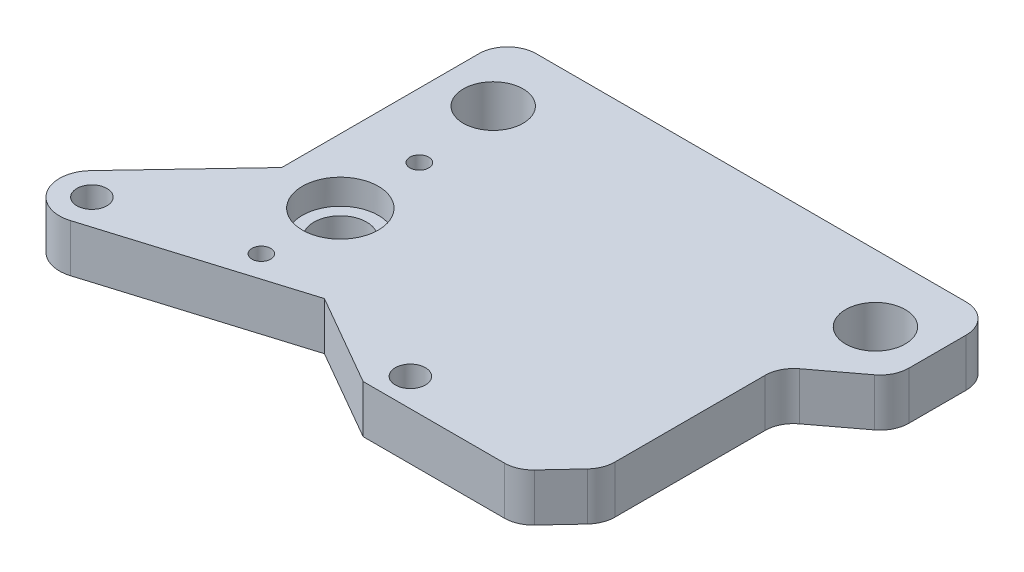
ISO-10303-21;
HEADER;
FILE_DESCRIPTION(('STEP AP214'),'2;1');
FILE_NAME('part.step','',(''),(''),'','','');
FILE_SCHEMA(('AUTOMOTIVE_DESIGN { 1 0 10303 214 1 1 1 1 }'));
ENDSEC;
DATA;
#1=APPLICATION_CONTEXT('core data for automotive mechanical design processes');
#2=APPLICATION_PROTOCOL_DEFINITION('international standard','automotive_design',2000,#1);
#3=PRODUCT_CONTEXT('',#1,'mechanical');
#4=PRODUCT('Part','Part','',(#3));
#5=PRODUCT_RELATED_PRODUCT_CATEGORY('part','',(#4));
#6=PRODUCT_DEFINITION_FORMATION('','',#4);
#7=PRODUCT_DEFINITION_CONTEXT('part definition',#1,'design');
#8=PRODUCT_DEFINITION('design','',#6,#7);
#9=PRODUCT_DEFINITION_SHAPE('','',#8);
#10=(LENGTH_UNIT() NAMED_UNIT(*) SI_UNIT(.MILLI.,.METRE.));
#11=(NAMED_UNIT(*) PLANE_ANGLE_UNIT() SI_UNIT($,.RADIAN.));
#12=(NAMED_UNIT(*) SI_UNIT($,.STERADIAN.) SOLID_ANGLE_UNIT());
#13=UNCERTAINTY_MEASURE_WITH_UNIT(LENGTH_MEASURE(1.E-05),#10,'distance_accuracy_value','');
#14=(GEOMETRIC_REPRESENTATION_CONTEXT(3) GLOBAL_UNCERTAINTY_ASSIGNED_CONTEXT((#13)) GLOBAL_UNIT_ASSIGNED_CONTEXT((#10,
#11,#12)) REPRESENTATION_CONTEXT('',''));
#15=CARTESIAN_POINT('',(0.,0.,0.));
#16=DIRECTION('',(0.,0.,1.));
#17=DIRECTION('',(1.,0.,0.));
#18=AXIS2_PLACEMENT_3D('',#15,#16,#17);
#19=CARTESIAN_POINT('',(0.,-6.35,0.));
#20=DIRECTION('',(0.,1.,0.));
#21=DIRECTION('',(0.,0.,1.));
#22=AXIS2_PLACEMENT_3D('',#19,#20,#21);
#23=CYLINDRICAL_SURFACE('',#22,5.05);
#24=CARTESIAN_POINT('',(0.,0.,0.));
#25=DIRECTION('',(0.,1.,0.));
#26=DIRECTION('',(0.,0.,1.));
#27=AXIS2_PLACEMENT_3D('',#24,#25,#26);
#28=CIRCLE('',#27,5.05);
#29=CARTESIAN_POINT('',(0.,0.,5.05));
#30=VERTEX_POINT('',#29);
#31=EDGE_CURVE('E266',#30,#30,#28,.T.);
#32=ORIENTED_EDGE('',*,*,#31,.T.);
#33=EDGE_LOOP('',(#32));
#34=FACE_BOUND('',#33,.T.);
#35=CARTESIAN_POINT('',(0.,-3.35,0.));
#36=DIRECTION('',(0.,-1.,0.));
#37=DIRECTION('',(0.,0.,-1.));
#38=AXIS2_PLACEMENT_3D('',#35,#36,#37);
#39=CIRCLE('',#38,5.05);
#40=CARTESIAN_POINT('',(0.,-3.35,-5.05));
#41=VERTEX_POINT('',#40);
#42=EDGE_CURVE('E11',#41,#41,#39,.F.);
#43=ORIENTED_EDGE('',*,*,#42,.F.);
#44=EDGE_LOOP('',(#43));
#45=FACE_BOUND('',#44,.T.);
#46=ADVANCED_FACE('F38',(#34,#45),#23,.F.);
#47=CARTESIAN_POINT('',(-17.78,-6.35,15.24));
#48=DIRECTION('',(0.,1.,0.));
#49=DIRECTION('',(0.,0.,1.));
#50=AXIS2_PLACEMENT_3D('',#47,#48,#49);
#51=CYLINDRICAL_SURFACE('',#50,4.318);
#52=CARTESIAN_POINT('',(-17.78,0.,15.24));
#53=DIRECTION('',(0.,1.,0.));
#54=DIRECTION('',(0.,0.,1.));
#55=AXIS2_PLACEMENT_3D('',#52,#53,#54);
#56=CIRCLE('',#55,4.318);
#57=CARTESIAN_POINT('',(-16.5178103251182,0.,19.3694068853313));
#58=VERTEX_POINT('',#57);
#59=CARTESIAN_POINT('',(-20.9174164667158,0.,12.2732270200805));
#60=VERTEX_POINT('',#59);
#61=EDGE_CURVE('E207',#58,#60,#56,.F.);
#62=ORIENTED_EDGE('',*,*,#61,.T.);
#63=DIRECTION('',(0.,1.,0.));
#64=VECTOR('',#63,1.);
#65=CARTESIAN_POINT('',(-20.9174164667158,-6.35,12.2732270200805));
#66=LINE('',#65,#64);
#67=CARTESIAN_POINT('',(-20.9174164667158,-6.35,12.2732270200805));
#68=VERTEX_POINT('',#67);
#69=EDGE_CURVE('E47',#68,#60,#66,.T.);
#70=ORIENTED_EDGE('',*,*,#69,.F.);
#71=CARTESIAN_POINT('',(-17.78,-6.35,15.24));
#72=DIRECTION('',(0.,1.,0.));
#73=DIRECTION('',(0.,0.,1.));
#74=AXIS2_PLACEMENT_3D('',#71,#72,#73);
#75=CIRCLE('',#74,4.318);
#76=CARTESIAN_POINT('',(-16.5178103251182,-6.35,19.3694068853313));
#77=VERTEX_POINT('',#76);
#78=EDGE_CURVE('E55',#77,#68,#75,.F.);
#79=ORIENTED_EDGE('',*,*,#78,.F.);
#80=DIRECTION('',(0.,1.,0.));
#81=VECTOR('',#80,1.);
#82=CARTESIAN_POINT('',(-16.5178103251182,-6.35,19.3694068853313));
#83=LINE('',#82,#81);
#84=EDGE_CURVE('E206',#77,#58,#83,.T.);
#85=ORIENTED_EDGE('',*,*,#84,.T.);
#86=EDGE_LOOP('',(#62,#70,#79,#85));
#87=FACE_BOUND('',#86,.T.);
#88=ADVANCED_FACE('F40',(#87),#51,.T.);
#89=CARTESIAN_POINT('',(-4.91597138022378,-6.35,-4.64859262888105));
#90=DIRECTION('',(-0.726590196089821,0.,-0.687071093080007));
#91=DIRECTION('',(-0.687071093080007,0.,0.726590196089821));
#92=AXIS2_PLACEMENT_3D('',#89,#90,#91);
#93=PLANE('',#92);
#94=DIRECTION('',(-0.687071093080007,0.,0.726590196089821));
#95=VECTOR('',#94,1.);
#96=CARTESIAN_POINT('',(-4.91597138022378,0.,-4.64859262888105));
#97=LINE('',#96,#95);
#98=CARTESIAN_POINT('',(-8.5725,0.,-0.781747008959347));
#99=VERTEX_POINT('',#98);
#100=EDGE_CURVE('E245',#99,#60,#97,.T.);
#101=ORIENTED_EDGE('',*,*,#100,.F.);
#102=DIRECTION('',(0.,1.,0.));
#103=VECTOR('',#102,1.);
#104=CARTESIAN_POINT('',(-8.5725,-6.35,-0.781747008959347));
#105=LINE('',#104,#103);
#106=CARTESIAN_POINT('',(-8.5725,-6.35,-0.781747008959347));
#107=VERTEX_POINT('',#106);
#108=EDGE_CURVE('E111',#107,#99,#105,.T.);
#109=ORIENTED_EDGE('',*,*,#108,.F.);
#110=DIRECTION('',(-0.687071093080007,0.,0.726590196089821));
#111=VECTOR('',#110,1.);
#112=CARTESIAN_POINT('',(-4.91597138022378,-6.35,-4.64859262888105));
#113=LINE('',#112,#111);
#114=EDGE_CURVE('E183',#107,#68,#113,.T.);
#115=ORIENTED_EDGE('',*,*,#114,.T.);
#116=ORIENTED_EDGE('',*,*,#69,.T.);
#117=EDGE_LOOP('',(#101,#109,#115,#116));
#118=FACE_BOUND('',#117,.T.);
#119=ADVANCED_FACE('F310',(#118),#93,.T.);
#120=CARTESIAN_POINT('',(-8.5725,-6.35,0.));
#121=DIRECTION('',(-1.,0.,0.));
#122=DIRECTION('',(0.,0.,1.));
#123=AXIS2_PLACEMENT_3D('',#120,#121,#122);
#124=PLANE('',#123);
#125=DIRECTION('',(0.,0.,1.));
#126=VECTOR('',#125,1.);
#127=CARTESIAN_POINT('',(-8.5725,0.,0.));
#128=LINE('',#127,#126);
#129=CARTESIAN_POINT('',(-8.5725,0.,-26.9875));
#130=VERTEX_POINT('',#129);
#131=EDGE_CURVE('E168',#130,#99,#128,.T.);
#132=ORIENTED_EDGE('',*,*,#131,.F.);
#133=DIRECTION('',(0.,1.,0.));
#134=VECTOR('',#133,1.);
#135=CARTESIAN_POINT('',(-8.5725,-6.35,-26.9875));
#136=LINE('',#135,#134);
#137=CARTESIAN_POINT('',(-8.5725,-6.35,-26.9875));
#138=VERTEX_POINT('',#137);
#139=EDGE_CURVE('E163',#138,#130,#136,.T.);
#140=ORIENTED_EDGE('',*,*,#139,.F.);
#141=DIRECTION('',(0.,0.,1.));
#142=VECTOR('',#141,1.);
#143=CARTESIAN_POINT('',(-8.5725,-6.35,0.));
#144=LINE('',#143,#142);
#145=EDGE_CURVE('E167',#138,#107,#144,.T.);
#146=ORIENTED_EDGE('',*,*,#145,.T.);
#147=ORIENTED_EDGE('',*,*,#108,.T.);
#148=EDGE_LOOP('',(#132,#140,#146,#147));
#149=FACE_BOUND('',#148,.T.);
#150=ADVANCED_FACE('F165',(#149),#124,.T.);
#151=CARTESIAN_POINT('',(-4.7625,-6.35,-26.9875));
#152=DIRECTION('',(0.,1.,0.));
#153=DIRECTION('',(0.,0.,1.));
#154=AXIS2_PLACEMENT_3D('',#151,#152,#153);
#155=CYLINDRICAL_SURFACE('',#154,3.81);
#156=CARTESIAN_POINT('',(-4.7625,0.,-26.9875));
#157=DIRECTION('',(0.,1.,0.));
#158=DIRECTION('',(0.,0.,1.));
#159=AXIS2_PLACEMENT_3D('',#156,#157,#158);
#160=CIRCLE('',#159,3.81);
#161=CARTESIAN_POINT('',(-4.7625,0.,-30.7975));
#162=VERTEX_POINT('',#161);
#163=EDGE_CURVE('E242',#130,#162,#160,.F.);
#164=ORIENTED_EDGE('',*,*,#163,.T.);
#165=DIRECTION('',(0.,1.,0.));
#166=VECTOR('',#165,1.);
#167=CARTESIAN_POINT('',(-4.7625,-6.35,-30.7975));
#168=LINE('',#167,#166);
#169=CARTESIAN_POINT('',(-4.7625,-6.35,-30.7975));
#170=VERTEX_POINT('',#169);
#171=EDGE_CURVE('E172',#170,#162,#168,.T.);
#172=ORIENTED_EDGE('',*,*,#171,.F.);
#173=CARTESIAN_POINT('',(-4.7625,-6.35,-26.9875));
#174=DIRECTION('',(0.,1.,0.));
#175=DIRECTION('',(0.,0.,1.));
#176=AXIS2_PLACEMENT_3D('',#173,#174,#175);
#177=CIRCLE('',#176,3.81);
#178=EDGE_CURVE('E175',#138,#170,#177,.F.);
#179=ORIENTED_EDGE('',*,*,#178,.F.);
#180=ORIENTED_EDGE('',*,*,#139,.T.);
#181=EDGE_LOOP('',(#164,#172,#179,#180));
#182=FACE_BOUND('',#181,.T.);
#183=ADVANCED_FACE('F176',(#182),#155,.T.);
#184=CARTESIAN_POINT('',(0.,-6.35,-30.7975));
#185=DIRECTION('',(0.,0.,-1.));
#186=DIRECTION('',(-1.,0.,0.));
#187=AXIS2_PLACEMENT_3D('',#184,#185,#186);
#188=PLANE('',#187);
#189=DIRECTION('',(-1.,0.,0.));
#190=VECTOR('',#189,1.);
#191=CARTESIAN_POINT('',(0.,0.,-30.7975));
#192=LINE('',#191,#190);
#193=CARTESIAN_POINT('',(52.3875,0.,-30.7975));
#194=VERTEX_POINT('',#193);
#195=EDGE_CURVE('E239',#194,#162,#192,.T.);
#196=ORIENTED_EDGE('',*,*,#195,.F.);
#197=DIRECTION('',(0.,1.,0.));
#198=VECTOR('',#197,1.);
#199=CARTESIAN_POINT('',(52.3875,-6.35,-30.7975));
#200=LINE('',#199,#198);
#201=CARTESIAN_POINT('',(52.3875,-6.35,-30.7975));
#202=VERTEX_POINT('',#201);
#203=EDGE_CURVE('E272',#202,#194,#200,.T.);
#204=ORIENTED_EDGE('',*,*,#203,.F.);
#205=DIRECTION('',(-1.,0.,0.));
#206=VECTOR('',#205,1.);
#207=CARTESIAN_POINT('',(0.,-6.35,-30.7975));
#208=LINE('',#207,#206);
#209=EDGE_CURVE('E179',#202,#170,#208,.T.);
#210=ORIENTED_EDGE('',*,*,#209,.T.);
#211=ORIENTED_EDGE('',*,*,#171,.T.);
#212=EDGE_LOOP('',(#196,#204,#210,#211));
#213=FACE_BOUND('',#212,.T.);
#214=ADVANCED_FACE('F429',(#213),#188,.T.);
#215=CARTESIAN_POINT('',(52.3875,-6.35,-26.9875));
#216=DIRECTION('',(0.,1.,0.));
#217=DIRECTION('',(0.,0.,1.));
#218=AXIS2_PLACEMENT_3D('',#215,#216,#217);
#219=CYLINDRICAL_SURFACE('',#218,3.81);
#220=CARTESIAN_POINT('',(52.3875,0.,-26.9875));
#221=DIRECTION('',(0.,1.,0.));
#222=DIRECTION('',(0.,0.,1.));
#223=AXIS2_PLACEMENT_3D('',#220,#221,#222);
#224=CIRCLE('',#223,3.81);
#225=CARTESIAN_POINT('',(56.1975,0.,-26.9875));
#226=VERTEX_POINT('',#225);
#227=EDGE_CURVE('E236',#194,#226,#224,.F.);
#228=ORIENTED_EDGE('',*,*,#227,.T.);
#229=DIRECTION('',(0.,1.,0.));
#230=VECTOR('',#229,1.);
#231=CARTESIAN_POINT('',(56.1975,-6.35,-26.9875));
#232=LINE('',#231,#230);
#233=CARTESIAN_POINT('',(56.1975,-6.35,-26.9875));
#234=VERTEX_POINT('',#233);
#235=EDGE_CURVE('E274',#234,#226,#232,.T.);
#236=ORIENTED_EDGE('',*,*,#235,.F.);
#237=CARTESIAN_POINT('',(52.3875,-6.35,-26.9875));
#238=DIRECTION('',(0.,1.,0.));
#239=DIRECTION('',(0.,0.,1.));
#240=AXIS2_PLACEMENT_3D('',#237,#238,#239);
#241=CIRCLE('',#240,3.81);
#242=EDGE_CURVE('E426',#202,#234,#241,.F.);
#243=ORIENTED_EDGE('',*,*,#242,.F.);
#244=ORIENTED_EDGE('',*,*,#203,.T.);
#245=EDGE_LOOP('',(#228,#236,#243,#244));
#246=FACE_BOUND('',#245,.T.);
#247=ADVANCED_FACE('F434',(#246),#219,.T.);
#248=CARTESIAN_POINT('',(56.1975,-6.35,1.02276151248003E-13));
#249=DIRECTION('',(1.,0.,0.));
#250=DIRECTION('',(0.,0.,-1.));
#251=AXIS2_PLACEMENT_3D('',#248,#249,#250);
#252=PLANE('',#251);
#253=DIRECTION('',(0.,0.,-1.));
#254=VECTOR('',#253,1.);
#255=CARTESIAN_POINT('',(56.1975,0.,1.02276151248003E-13));
#256=LINE('',#255,#254);
#257=CARTESIAN_POINT('',(56.1975,0.,-19.3620959266836));
#258=VERTEX_POINT('',#257);
#259=EDGE_CURVE('E233',#258,#226,#256,.T.);
#260=ORIENTED_EDGE('',*,*,#259,.F.);
#261=DIRECTION('',(0.,1.,0.));
#262=VECTOR('',#261,1.);
#263=CARTESIAN_POINT('',(56.1975,-6.35,-19.3620959266836));
#264=LINE('',#263,#262);
#265=CARTESIAN_POINT('',(56.1975,-6.35,-19.3620959266836));
#266=VERTEX_POINT('',#265);
#267=EDGE_CURVE('E276',#266,#258,#264,.T.);
#268=ORIENTED_EDGE('',*,*,#267,.F.);
#269=DIRECTION('',(0.,0.,-1.));
#270=VECTOR('',#269,1.);
#271=CARTESIAN_POINT('',(56.1975,-6.35,1.02276151248003E-13));
#272=LINE('',#271,#270);
#273=EDGE_CURVE('E423',#266,#234,#272,.T.);
#274=ORIENTED_EDGE('',*,*,#273,.T.);
#275=ORIENTED_EDGE('',*,*,#235,.T.);
#276=EDGE_LOOP('',(#260,#268,#274,#275));
#277=FACE_BOUND('',#276,.T.);
#278=ADVANCED_FACE('F438',(#277),#252,.T.);
#279=CARTESIAN_POINT('',(52.3875,-6.35,-19.3620959266836));
#280=DIRECTION('',(0.,1.,0.));
#281=DIRECTION('',(0.,0.,1.));
#282=AXIS2_PLACEMENT_3D('',#279,#280,#281);
#283=CYLINDRICAL_SURFACE('',#282,3.81);
#284=CARTESIAN_POINT('',(52.3875,0.,-19.3620959266836));
#285=DIRECTION('',(0.,1.,0.));
#286=DIRECTION('',(0.,0.,1.));
#287=AXIS2_PLACEMENT_3D('',#284,#285,#286);
#288=CIRCLE('',#287,3.81);
#289=CARTESIAN_POINT('',(54.6804152382093,0.,-16.3192946334034));
#290=VERTEX_POINT('',#289);
#291=EDGE_CURVE('E230',#258,#290,#288,.F.);
#292=ORIENTED_EDGE('',*,*,#291,.T.);
#293=DIRECTION('',(0.,1.,0.));
#294=VECTOR('',#293,1.);
#295=CARTESIAN_POINT('',(54.6804152382093,-6.35,-16.3192946334034));
#296=LINE('',#295,#294);
#297=CARTESIAN_POINT('',(54.6804152382093,-6.35,-16.3192946334034));
#298=VERTEX_POINT('',#297);
#299=EDGE_CURVE('E278',#298,#290,#296,.T.);
#300=ORIENTED_EDGE('',*,*,#299,.F.);
#301=CARTESIAN_POINT('',(52.3875,-6.35,-19.3620959266836));
#302=DIRECTION('',(0.,1.,0.));
#303=DIRECTION('',(0.,0.,1.));
#304=AXIS2_PLACEMENT_3D('',#301,#302,#303);
#305=CIRCLE('',#304,3.81);
#306=EDGE_CURVE('E421',#266,#298,#305,.F.);
#307=ORIENTED_EDGE('',*,*,#306,.F.);
#308=ORIENTED_EDGE('',*,*,#267,.T.);
#309=EDGE_LOOP('',(#292,#300,#307,#308));
#310=FACE_BOUND('',#309,.T.);
#311=ADVANCED_FACE('F443',(#310),#283,.T.);
#312=CARTESIAN_POINT('',(11.9606686655756,-6.35,15.8723434157696));
#313=DIRECTION('',(0.601815023152047,0.,0.798635510047294));
#314=DIRECTION('',(0.798635510047294,0.,-0.601815023152047));
#315=AXIS2_PLACEMENT_3D('',#312,#313,#314);
#316=PLANE('',#315);
#317=DIRECTION('',(0.798635510047294,0.,-0.601815023152047));
#318=VECTOR('',#317,1.);
#319=CARTESIAN_POINT('',(11.9606686655756,0.,15.8723434157696));
#320=LINE('',#319,#318);
#321=CARTESIAN_POINT('',(48.9855664772033,0.,-12.0279182848244));
#322=VERTEX_POINT('',#321);
#323=EDGE_CURVE('E227',#322,#290,#320,.T.);
#324=ORIENTED_EDGE('',*,*,#323,.F.);
#325=DIRECTION('',(0.,1.,0.));
#326=VECTOR('',#325,1.);
#327=CARTESIAN_POINT('',(48.9855664772033,-6.35,-12.0279182848244));
#328=LINE('',#327,#326);
#329=CARTESIAN_POINT('',(48.9855664772033,-6.35,-12.0279182848244));
#330=VERTEX_POINT('',#329);
#331=EDGE_CURVE('E280',#330,#322,#328,.T.);
#332=ORIENTED_EDGE('',*,*,#331,.F.);
#333=DIRECTION('',(0.798635510047294,0.,-0.601815023152047));
#334=VECTOR('',#333,1.);
#335=CARTESIAN_POINT('',(11.9606686655756,-6.35,15.8723434157696));
#336=LINE('',#335,#334);
#337=EDGE_CURVE('E418',#330,#298,#336,.T.);
#338=ORIENTED_EDGE('',*,*,#337,.T.);
#339=ORIENTED_EDGE('',*,*,#299,.T.);
#340=EDGE_LOOP('',(#324,#332,#338,#339));
#341=FACE_BOUND('',#340,.T.);
#342=ADVANCED_FACE('F479',(#341),#316,.T.);
#343=CARTESIAN_POINT('',(51.2784817154126,-6.35,-8.98511699154425));
#344=DIRECTION('',(0.,1.,0.));
#345=DIRECTION('',(0.,0.,1.));
#346=AXIS2_PLACEMENT_3D('',#343,#344,#345);
#347=CYLINDRICAL_SURFACE('',#346,3.80999999999999);
#348=CARTESIAN_POINT('',(51.2784817154126,0.,-8.98511699154425));
#349=DIRECTION('',(0.,1.,0.));
#350=DIRECTION('',(0.,0.,1.));
#351=AXIS2_PLACEMENT_3D('',#348,#349,#350);
#352=CIRCLE('',#351,3.80999999999999);
#353=CARTESIAN_POINT('',(47.4684817154126,0.,-8.98511699154425));
#354=VERTEX_POINT('',#353);
#355=EDGE_CURVE('E224',#354,#322,#352,.F.);
#356=ORIENTED_EDGE('',*,*,#355,.F.);
#357=DIRECTION('',(0.,1.,0.));
#358=VECTOR('',#357,1.);
#359=CARTESIAN_POINT('',(47.4684817154126,-6.35,-8.98511699154425));
#360=LINE('',#359,#358);
#361=CARTESIAN_POINT('',(47.4684817154126,-6.35,-8.98511699154425));
#362=VERTEX_POINT('',#361);
#363=EDGE_CURVE('E282',#362,#354,#360,.T.);
#364=ORIENTED_EDGE('',*,*,#363,.F.);
#365=CARTESIAN_POINT('',(51.2784817154126,-6.35,-8.98511699154425));
#366=DIRECTION('',(0.,1.,0.));
#367=DIRECTION('',(0.,0.,1.));
#368=AXIS2_PLACEMENT_3D('',#365,#366,#367);
#369=CIRCLE('',#368,3.80999999999999);
#370=EDGE_CURVE('E415',#362,#330,#369,.F.);
#371=ORIENTED_EDGE('',*,*,#370,.T.);
#372=ORIENTED_EDGE('',*,*,#331,.T.);
#373=EDGE_LOOP('',(#356,#364,#371,#372));
#374=FACE_BOUND('',#373,.T.);
#375=ADVANCED_FACE('F449',(#374),#347,.F.);
#376=CARTESIAN_POINT('',(47.4684817154126,-6.35,0.));
#377=DIRECTION('',(-1.,0.,0.));
#378=DIRECTION('',(0.,0.,1.));
#379=AXIS2_PLACEMENT_3D('',#376,#377,#378);
#380=PLANE('',#379);
#381=DIRECTION('',(0.,0.,1.));
#382=VECTOR('',#381,1.);
#383=CARTESIAN_POINT('',(47.4684817154126,0.,0.));
#384=LINE('',#383,#382);
#385=CARTESIAN_POINT('',(47.4684817154126,0.,10.9806107725939));
#386=VERTEX_POINT('',#385);
#387=EDGE_CURVE('E222',#354,#386,#384,.T.);
#388=ORIENTED_EDGE('',*,*,#387,.T.);
#389=DIRECTION('',(0.,1.,0.));
#390=VECTOR('',#389,1.);
#391=CARTESIAN_POINT('',(47.4684817154126,-6.35,10.9806107725939));
#392=LINE('',#391,#390);
#393=CARTESIAN_POINT('',(47.4684817154126,-6.35,10.9806107725939));
#394=VERTEX_POINT('',#393);
#395=EDGE_CURVE('E284',#394,#386,#392,.T.);
#396=ORIENTED_EDGE('',*,*,#395,.F.);
#397=DIRECTION('',(0.,0.,1.));
#398=VECTOR('',#397,1.);
#399=CARTESIAN_POINT('',(47.4684817154126,-6.35,0.));
#400=LINE('',#399,#398);
#401=EDGE_CURVE('E413',#362,#394,#400,.T.);
#402=ORIENTED_EDGE('',*,*,#401,.F.);
#403=ORIENTED_EDGE('',*,*,#363,.T.);
#404=EDGE_LOOP('',(#388,#396,#402,#403));
#405=FACE_BOUND('',#404,.T.);
#406=ADVANCED_FACE('F455',(#405),#380,.F.);
#407=CARTESIAN_POINT('',(43.6584817154126,-6.35,10.9806107725939));
#408=DIRECTION('',(0.,1.,0.));
#409=DIRECTION('',(0.,0.,1.));
#410=AXIS2_PLACEMENT_3D('',#407,#408,#409);
#411=CYLINDRICAL_SURFACE('',#410,3.81);
#412=CARTESIAN_POINT('',(43.6584817154126,0.,10.9806107725939));
#413=DIRECTION('',(0.,1.,0.));
#414=DIRECTION('',(0.,0.,1.));
#415=AXIS2_PLACEMENT_3D('',#412,#413,#414);
#416=CIRCLE('',#415,3.81);
#417=CARTESIAN_POINT('',(46.4449393185816,0.,13.579024524432));
#418=VERTEX_POINT('',#417);
#419=EDGE_CURVE('E220',#386,#418,#416,.F.);
#420=ORIENTED_EDGE('',*,*,#419,.T.);
#421=DIRECTION('',(0.,1.,0.));
#422=VECTOR('',#421,1.);
#423=CARTESIAN_POINT('',(46.4449393185816,-6.35,13.579024524432));
#424=LINE('',#423,#422);
#425=CARTESIAN_POINT('',(46.4449393185816,-6.35,13.579024524432));
#426=VERTEX_POINT('',#425);
#427=EDGE_CURVE('E287',#426,#418,#424,.T.);
#428=ORIENTED_EDGE('',*,*,#427,.F.);
#429=CARTESIAN_POINT('',(43.6584817154126,-6.35,10.9806107725939));
#430=DIRECTION('',(0.,1.,0.));
#431=DIRECTION('',(0.,0.,1.));
#432=AXIS2_PLACEMENT_3D('',#429,#430,#431);
#433=CIRCLE('',#432,3.81);
#434=EDGE_CURVE('E411',#394,#426,#433,.F.);
#435=ORIENTED_EDGE('',*,*,#434,.F.);
#436=ORIENTED_EDGE('',*,*,#395,.T.);
#437=EDGE_LOOP('',(#420,#428,#435,#436));
#438=FACE_BOUND('',#437,.T.);
#439=ADVANCED_FACE('F461',(#438),#411,.T.);
#440=CARTESIAN_POINT('',(31.6153606059378,-6.35,29.4818007187193));
#441=DIRECTION('',(-0.73135370161917,0.,-0.681998360062499));
#442=DIRECTION('',(-0.681998360062499,0.,0.73135370161917));
#443=AXIS2_PLACEMENT_3D('',#440,#441,#442);
#444=PLANE('',#443);
#445=DIRECTION('',(-0.681998360062499,0.,0.73135370161917));
#446=VECTOR('',#445,1.);
#447=CARTESIAN_POINT('',(31.6153606059378,0.,29.4818007187193));
#448=LINE('',#447,#446);
#449=CARTESIAN_POINT('',(43.0441600965525,0.,17.2259137518381));
#450=VERTEX_POINT('',#449);
#451=EDGE_CURVE('E218',#418,#450,#448,.T.);
#452=ORIENTED_EDGE('',*,*,#451,.T.);
#453=DIRECTION('',(0.,1.,0.));
#454=VECTOR('',#453,1.);
#455=CARTESIAN_POINT('',(43.0441600965525,-6.35,17.2259137518381));
#456=LINE('',#455,#454);
#457=CARTESIAN_POINT('',(43.0441600965525,-6.35,17.2259137518381));
#458=VERTEX_POINT('',#457);
#459=EDGE_CURVE('E290',#458,#450,#456,.T.);
#460=ORIENTED_EDGE('',*,*,#459,.F.);
#461=DIRECTION('',(-0.681998360062499,0.,0.73135370161917));
#462=VECTOR('',#461,1.);
#463=CARTESIAN_POINT('',(31.6153606059378,-6.35,29.4818007187193));
#464=LINE('',#463,#462);
#465=EDGE_CURVE('E409',#426,#458,#464,.T.);
#466=ORIENTED_EDGE('',*,*,#465,.F.);
#467=ORIENTED_EDGE('',*,*,#427,.T.);
#468=EDGE_LOOP('',(#452,#460,#466,#467));
#469=FACE_BOUND('',#468,.T.);
#470=ADVANCED_FACE('F465',(#469),#444,.F.);
#471=CARTESIAN_POINT('',(40.2577024933834,-6.35,14.6275));
#472=DIRECTION('',(0.,1.,0.));
#473=DIRECTION('',(0.,0.,1.));
#474=AXIS2_PLACEMENT_3D('',#471,#472,#473);
#475=CYLINDRICAL_SURFACE('',#474,3.81);
#476=CARTESIAN_POINT('',(40.2577024933834,0.,14.6275));
#477=DIRECTION('',(0.,1.,0.));
#478=DIRECTION('',(0.,0.,1.));
#479=AXIS2_PLACEMENT_3D('',#476,#477,#478);
#480=CIRCLE('',#479,3.81);
#481=CARTESIAN_POINT('',(40.2577024933834,0.,18.4375));
#482=VERTEX_POINT('',#481);
#483=EDGE_CURVE('E216',#450,#482,#480,.F.);
#484=ORIENTED_EDGE('',*,*,#483,.T.);
#485=DIRECTION('',(0.,1.,0.));
#486=VECTOR('',#485,1.);
#487=CARTESIAN_POINT('',(40.2577024933834,-6.35,18.4375));
#488=LINE('',#487,#486);
#489=CARTESIAN_POINT('',(40.2577024933834,-6.35,18.4375));
#490=VERTEX_POINT('',#489);
#491=EDGE_CURVE('E293',#490,#482,#488,.T.);
#492=ORIENTED_EDGE('',*,*,#491,.F.);
#493=CARTESIAN_POINT('',(40.2577024933834,-6.35,14.6275));
#494=DIRECTION('',(0.,1.,0.));
#495=DIRECTION('',(0.,0.,1.));
#496=AXIS2_PLACEMENT_3D('',#493,#494,#495);
#497=CIRCLE('',#496,3.81);
#498=EDGE_CURVE('E407',#458,#490,#497,.F.);
#499=ORIENTED_EDGE('',*,*,#498,.F.);
#500=ORIENTED_EDGE('',*,*,#459,.T.);
#501=EDGE_LOOP('',(#484,#492,#499,#500));
#502=FACE_BOUND('',#501,.T.);
#503=ADVANCED_FACE('F470',(#502),#475,.T.);
#504=CARTESIAN_POINT('',(0.,-6.35,18.4375));
#505=DIRECTION('',(0.,0.,-1.));
#506=DIRECTION('',(-1.,0.,0.));
#507=AXIS2_PLACEMENT_3D('',#504,#505,#506);
#508=PLANE('',#507);
#509=DIRECTION('',(-1.,0.,0.));
#510=VECTOR('',#509,1.);
#511=CARTESIAN_POINT('',(0.,0.,18.4375));
#512=LINE('',#511,#510);
#513=CARTESIAN_POINT('',(21.4659698195551,0.,18.4375));
#514=VERTEX_POINT('',#513);
#515=EDGE_CURVE('E214',#482,#514,#512,.T.);
#516=ORIENTED_EDGE('',*,*,#515,.T.);
#517=DIRECTION('',(0.,1.,0.));
#518=VECTOR('',#517,1.);
#519=CARTESIAN_POINT('',(21.4659698195551,-6.35,18.4375));
#520=LINE('',#519,#518);
#521=CARTESIAN_POINT('',(21.4659698195551,-6.35,18.4375));
#522=VERTEX_POINT('',#521);
#523=EDGE_CURVE('E296',#522,#514,#520,.T.);
#524=ORIENTED_EDGE('',*,*,#523,.F.);
#525=DIRECTION('',(-1.,0.,0.));
#526=VECTOR('',#525,1.);
#527=CARTESIAN_POINT('',(0.,-6.35,18.4375));
#528=LINE('',#527,#526);
#529=EDGE_CURVE('E405',#490,#522,#528,.T.);
#530=ORIENTED_EDGE('',*,*,#529,.F.);
#531=ORIENTED_EDGE('',*,*,#491,.T.);
#532=EDGE_LOOP('',(#516,#524,#530,#531));
#533=FACE_BOUND('',#532,.T.);
#534=ADVANCED_FACE('F476',(#533),#508,.F.);
#535=CARTESIAN_POINT('',(-2.63069175478496,-6.35,4.57176574770906));
#536=DIRECTION('',(0.498745579538251,0.,-0.866748433451745));
#537=DIRECTION('',(-0.866748433451745,0.,-0.498745579538251));
#538=AXIS2_PLACEMENT_3D('',#535,#536,#537);
#539=PLANE('',#538);
#540=DIRECTION('',(-0.866748433451745,0.,-0.498745579538251));
#541=VECTOR('',#540,1.);
#542=CARTESIAN_POINT('',(-2.63069175478496,0.,4.57176574770906));
#543=LINE('',#542,#541);
#544=CARTESIAN_POINT('',(9.34656141689971,0.,11.4637332942772));
#545=VERTEX_POINT('',#544);
#546=EDGE_CURVE('E212',#514,#545,#543,.T.);
#547=ORIENTED_EDGE('',*,*,#546,.T.);
#548=DIRECTION('',(0.,1.,0.));
#549=VECTOR('',#548,1.);
#550=CARTESIAN_POINT('',(9.34656141689971,-6.35,11.4637332942772));
#551=LINE('',#550,#549);
#552=CARTESIAN_POINT('',(9.34656141689971,-6.35,11.4637332942772));
#553=VERTEX_POINT('',#552);
#554=EDGE_CURVE('E299',#553,#545,#551,.T.);
#555=ORIENTED_EDGE('',*,*,#554,.F.);
#556=DIRECTION('',(-0.866748433451745,0.,-0.498745579538251));
#557=VECTOR('',#556,1.);
#558=CARTESIAN_POINT('',(-2.63069175478496,-6.35,4.57176574770906));
#559=LINE('',#558,#557);
#560=EDGE_CURVE('E403',#522,#553,#559,.T.);
#561=ORIENTED_EDGE('',*,*,#560,.F.);
#562=ORIENTED_EDGE('',*,*,#523,.T.);
#563=EDGE_LOOP('',(#547,#555,#561,#562));
#564=FACE_BOUND('',#563,.T.);
#565=ADVANCED_FACE('F332',(#564),#539,.F.);
#566=CARTESIAN_POINT('',(-1.5875,-6.35,-21.9075));
#567=DIRECTION('',(0.,1.,0.));
#568=DIRECTION('',(0.,0.,1.));
#569=AXIS2_PLACEMENT_3D('',#566,#567,#568);
#570=CYLINDRICAL_SURFACE('',#569,3.96875);
#571=CARTESIAN_POINT('',(-1.5875,-6.35,-21.9075));
#572=DIRECTION('',(0.,1.,0.));
#573=DIRECTION('',(0.,0.,1.));
#574=AXIS2_PLACEMENT_3D('',#571,#572,#573);
#575=CIRCLE('',#574,3.96875);
#576=CARTESIAN_POINT('',(-1.5875,-6.35,-17.93875));
#577=VERTEX_POINT('',#576);
#578=EDGE_CURVE('E203',#577,#577,#575,.T.);
#579=ORIENTED_EDGE('',*,*,#578,.F.);
#580=EDGE_LOOP('',(#579));
#581=FACE_BOUND('',#580,.T.);
#582=CARTESIAN_POINT('',(-1.5875,0.,-21.9075));
#583=DIRECTION('',(0.,1.,0.));
#584=DIRECTION('',(0.,0.,1.));
#585=AXIS2_PLACEMENT_3D('',#582,#583,#584);
#586=CIRCLE('',#585,3.96875);
#587=CARTESIAN_POINT('',(-1.5875,0.,-17.93875));
#588=VERTEX_POINT('',#587);
#589=EDGE_CURVE('E263',#588,#588,#586,.T.);
#590=ORIENTED_EDGE('',*,*,#589,.T.);
#591=EDGE_LOOP('',(#590));
#592=FACE_BOUND('',#591,.T.);
#593=ADVANCED_FACE('F328',(#581,#592),#570,.F.);
#594=CARTESIAN_POINT('',(49.2125,-6.35,-21.9075));
#595=DIRECTION('',(0.,1.,0.));
#596=DIRECTION('',(0.,0.,1.));
#597=AXIS2_PLACEMENT_3D('',#594,#595,#596);
#598=CYLINDRICAL_SURFACE('',#597,3.96874999999998);
#599=CARTESIAN_POINT('',(49.2125,-6.35,-21.9075));
#600=DIRECTION('',(0.,1.,0.));
#601=DIRECTION('',(0.,0.,1.));
#602=AXIS2_PLACEMENT_3D('',#599,#600,#601);
#603=CIRCLE('',#602,3.96874999999998);
#604=CARTESIAN_POINT('',(49.2125,-6.35,-17.93875));
#605=VERTEX_POINT('',#604);
#606=EDGE_CURVE('E200',#605,#605,#603,.T.);
#607=ORIENTED_EDGE('',*,*,#606,.F.);
#608=EDGE_LOOP('',(#607));
#609=FACE_BOUND('',#608,.T.);
#610=CARTESIAN_POINT('',(49.2125,0.,-21.9075));
#611=DIRECTION('',(0.,1.,0.));
#612=DIRECTION('',(0.,0.,1.));
#613=AXIS2_PLACEMENT_3D('',#610,#611,#612);
#614=CIRCLE('',#613,3.96874999999998);
#615=CARTESIAN_POINT('',(49.2125,0.,-17.93875));
#616=VERTEX_POINT('',#615);
#617=EDGE_CURVE('E260',#616,#616,#614,.T.);
#618=ORIENTED_EDGE('',*,*,#617,.T.);
#619=EDGE_LOOP('',(#618));
#620=FACE_BOUND('',#619,.T.);
#621=ADVANCED_FACE('F331',(#609,#620),#598,.F.);
#622=CARTESIAN_POINT('',(24.0125212267774,-6.35,14.7035990265501));
#623=DIRECTION('',(0.,1.,0.));
#624=DIRECTION('',(0.,0.,1.));
#625=AXIS2_PLACEMENT_3D('',#622,#623,#624);
#626=CYLINDRICAL_SURFACE('',#625,2.00000000000001);
#627=CARTESIAN_POINT('',(24.0125212267774,-6.35,14.7035990265501));
#628=DIRECTION('',(0.,1.,0.));
#629=DIRECTION('',(0.,0.,1.));
#630=AXIS2_PLACEMENT_3D('',#627,#628,#629);
#631=CIRCLE('',#630,2.00000000000001);
#632=CARTESIAN_POINT('',(24.0125212267774,-6.35,16.7035990265501));
#633=VERTEX_POINT('',#632);
#634=EDGE_CURVE('E197',#633,#633,#631,.T.);
#635=ORIENTED_EDGE('',*,*,#634,.F.);
#636=EDGE_LOOP('',(#635));
#637=FACE_BOUND('',#636,.T.);
#638=CARTESIAN_POINT('',(24.0125212267774,0.,14.7035990265501));
#639=DIRECTION('',(0.,1.,0.));
#640=DIRECTION('',(0.,0.,1.));
#641=AXIS2_PLACEMENT_3D('',#638,#639,#640);
#642=CIRCLE('',#641,2.00000000000001);
#643=CARTESIAN_POINT('',(24.0125212267774,0.,16.7035990265501));
#644=VERTEX_POINT('',#643);
#645=EDGE_CURVE('E257',#644,#644,#642,.T.);
#646=ORIENTED_EDGE('',*,*,#645,.T.);
#647=EDGE_LOOP('',(#646));
#648=FACE_BOUND('',#647,.T.);
#649=ADVANCED_FACE('F336',(#637,#648),#626,.F.);
#650=CARTESIAN_POINT('',(-17.78,-6.35,15.24));
#651=DIRECTION('',(0.,1.,0.));
#652=DIRECTION('',(0.,0.,1.));
#653=AXIS2_PLACEMENT_3D('',#650,#651,#652);
#654=CYLINDRICAL_SURFACE('',#653,2.);
#655=CARTESIAN_POINT('',(-17.78,-6.35,15.24));
#656=DIRECTION('',(0.,1.,0.));
#657=DIRECTION('',(0.,0.,1.));
#658=AXIS2_PLACEMENT_3D('',#655,#656,#657);
#659=CIRCLE('',#658,2.);
#660=CARTESIAN_POINT('',(-17.78,-6.35,17.24));
#661=VERTEX_POINT('',#660);
#662=EDGE_CURVE('E194',#661,#661,#659,.T.);
#663=ORIENTED_EDGE('',*,*,#662,.F.);
#664=EDGE_LOOP('',(#663));
#665=FACE_BOUND('',#664,.T.);
#666=CARTESIAN_POINT('',(-17.78,0.,15.24));
#667=DIRECTION('',(0.,1.,0.));
#668=DIRECTION('',(0.,0.,1.));
#669=AXIS2_PLACEMENT_3D('',#666,#667,#668);
#670=CIRCLE('',#669,2.);
#671=CARTESIAN_POINT('',(-17.78,0.,17.24));
#672=VERTEX_POINT('',#671);
#673=EDGE_CURVE('E254',#672,#672,#670,.T.);
#674=ORIENTED_EDGE('',*,*,#673,.T.);
#675=EDGE_LOOP('',(#674));
#676=FACE_BOUND('',#675,.T.);
#677=ADVANCED_FACE('F340',(#665,#676),#654,.F.);
#678=CARTESIAN_POINT('',(0.,-6.35,10.5));
#679=DIRECTION('',(0.,1.,0.));
#680=DIRECTION('',(0.,0.,1.));
#681=AXIS2_PLACEMENT_3D('',#678,#679,#680);
#682=CYLINDRICAL_SURFACE('',#681,1.25);
#683=CARTESIAN_POINT('',(0.,-6.35,10.5));
#684=DIRECTION('',(0.,1.,0.));
#685=DIRECTION('',(0.,0.,1.));
#686=AXIS2_PLACEMENT_3D('',#683,#684,#685);
#687=CIRCLE('',#686,1.25);
#688=CARTESIAN_POINT('',(0.,-6.35,11.75));
#689=VERTEX_POINT('',#688);
#690=EDGE_CURVE('E191',#689,#689,#687,.T.);
#691=ORIENTED_EDGE('',*,*,#690,.F.);
#692=EDGE_LOOP('',(#691));
#693=FACE_BOUND('',#692,.T.);
#694=CARTESIAN_POINT('',(0.,0.,10.5));
#695=DIRECTION('',(0.,1.,0.));
#696=DIRECTION('',(0.,0.,1.));
#697=AXIS2_PLACEMENT_3D('',#694,#695,#696);
#698=CIRCLE('',#697,1.25);
#699=CARTESIAN_POINT('',(0.,0.,11.75));
#700=VERTEX_POINT('',#699);
#701=EDGE_CURVE('E251',#700,#700,#698,.T.);
#702=ORIENTED_EDGE('',*,*,#701,.T.);
#703=EDGE_LOOP('',(#702));
#704=FACE_BOUND('',#703,.T.);
#705=ADVANCED_FACE('F344',(#693,#704),#682,.F.);
#706=CARTESIAN_POINT('',(0.,-6.35,-10.5));
#707=DIRECTION('',(0.,1.,0.));
#708=DIRECTION('',(0.,0.,1.));
#709=AXIS2_PLACEMENT_3D('',#706,#707,#708);
#710=CYLINDRICAL_SURFACE('',#709,1.25);
#711=CARTESIAN_POINT('',(0.,-6.35,-10.5));
#712=DIRECTION('',(0.,1.,0.));
#713=DIRECTION('',(0.,0.,1.));
#714=AXIS2_PLACEMENT_3D('',#711,#712,#713);
#715=CIRCLE('',#714,1.25);
#716=CARTESIAN_POINT('',(0.,-6.35,-9.25));
#717=VERTEX_POINT('',#716);
#718=EDGE_CURVE('E185',#717,#717,#715,.T.);
#719=ORIENTED_EDGE('',*,*,#718,.F.);
#720=EDGE_LOOP('',(#719));
#721=FACE_BOUND('',#720,.T.);
#722=CARTESIAN_POINT('',(0.,0.,-10.5));
#723=DIRECTION('',(0.,1.,0.));
#724=DIRECTION('',(0.,0.,1.));
#725=AXIS2_PLACEMENT_3D('',#722,#723,#724);
#726=CIRCLE('',#725,1.25);
#727=CARTESIAN_POINT('',(0.,0.,-9.25));
#728=VERTEX_POINT('',#727);
#729=EDGE_CURVE('E248',#728,#728,#726,.T.);
#730=ORIENTED_EDGE('',*,*,#729,.T.);
#731=EDGE_LOOP('',(#730));
#732=FACE_BOUND('',#731,.T.);
#733=ADVANCED_FACE('F347',(#721,#732),#710,.F.);
#734=CARTESIAN_POINT('',(4.00320661854568,-6.35,13.0969768672636));
#735=DIRECTION('',(-0.29230886403007,0.,-0.95632396603319));
#736=DIRECTION('',(-0.95632396603319,0.,0.29230886403007));
#737=AXIS2_PLACEMENT_3D('',#734,#735,#736);
#738=PLANE('',#737);
#739=DIRECTION('',(-0.95632396603319,0.,0.29230886403007));
#740=VECTOR('',#739,1.);
#741=CARTESIAN_POINT('',(4.00320661854568,0.,13.0969768672636));
#742=LINE('',#741,#740);
#743=EDGE_CURVE('E209',#545,#58,#742,.T.);
#744=ORIENTED_EDGE('',*,*,#743,.T.);
#745=ORIENTED_EDGE('',*,*,#84,.F.);
#746=DIRECTION('',(-0.95632396603319,0.,0.29230886403007));
#747=VECTOR('',#746,1.);
#748=CARTESIAN_POINT('',(4.00320661854568,-6.35,13.0969768672636));
#749=LINE('',#748,#747);
#750=EDGE_CURVE('E123',#553,#77,#749,.T.);
#751=ORIENTED_EDGE('',*,*,#750,.F.);
#752=ORIENTED_EDGE('',*,*,#554,.T.);
#753=EDGE_LOOP('',(#744,#745,#751,#752));
#754=FACE_BOUND('',#753,.T.);
#755=ADVANCED_FACE('F350',(#754),#738,.F.);
#756=CARTESIAN_POINT('',(0.,-6.35,0.));
#757=DIRECTION('',(0.,1.,0.));
#758=DIRECTION('',(0.,0.,1.));
#759=AXIS2_PLACEMENT_3D('',#756,#757,#758);
#760=PLANE('',#759);
#761=ORIENTED_EDGE('',*,*,#78,.T.);
#762=ORIENTED_EDGE('',*,*,#114,.F.);
#763=ORIENTED_EDGE('',*,*,#145,.F.);
#764=ORIENTED_EDGE('',*,*,#178,.T.);
#765=ORIENTED_EDGE('',*,*,#209,.F.);
#766=ORIENTED_EDGE('',*,*,#242,.T.);
#767=ORIENTED_EDGE('',*,*,#273,.F.);
#768=ORIENTED_EDGE('',*,*,#306,.T.);
#769=ORIENTED_EDGE('',*,*,#337,.F.);
#770=ORIENTED_EDGE('',*,*,#370,.F.);
#771=ORIENTED_EDGE('',*,*,#401,.T.);
#772=ORIENTED_EDGE('',*,*,#434,.T.);
#773=ORIENTED_EDGE('',*,*,#465,.T.);
#774=ORIENTED_EDGE('',*,*,#498,.T.);
#775=ORIENTED_EDGE('',*,*,#529,.T.);
#776=ORIENTED_EDGE('',*,*,#560,.T.);
#777=ORIENTED_EDGE('',*,*,#750,.T.);
#778=EDGE_LOOP('',(#761,#762,#763,#764,#765,#766,#767,#768,#769,#770,#771,#772,#773,#774,#775,
#776,#777));
#779=FACE_BOUND('',#778,.T.);
#780=ORIENTED_EDGE('',*,*,#718,.T.);
#781=EDGE_LOOP('',(#780));
#782=FACE_BOUND('',#781,.T.);
#783=ORIENTED_EDGE('',*,*,#690,.T.);
#784=EDGE_LOOP('',(#783));
#785=FACE_BOUND('',#784,.T.);
#786=ORIENTED_EDGE('',*,*,#662,.T.);
#787=EDGE_LOOP('',(#786));
#788=FACE_BOUND('',#787,.T.);
#789=ORIENTED_EDGE('',*,*,#634,.T.);
#790=EDGE_LOOP('',(#789));
#791=FACE_BOUND('',#790,.T.);
#792=ORIENTED_EDGE('',*,*,#606,.T.);
#793=EDGE_LOOP('',(#792));
#794=FACE_BOUND('',#793,.T.);
#795=ORIENTED_EDGE('',*,*,#578,.T.);
#796=EDGE_LOOP('',(#795));
#797=FACE_BOUND('',#796,.T.);
#798=CARTESIAN_POINT('',(0.,-6.35,0.));
#799=DIRECTION('',(0.,-1.,0.));
#800=DIRECTION('',(0.,0.,-1.));
#801=AXIS2_PLACEMENT_3D('',#798,#799,#800);
#802=CIRCLE('',#801,3.499999985);
#803=CARTESIAN_POINT('',(0.,-6.35,-3.499999985));
#804=VERTEX_POINT('',#803);
#805=EDGE_CURVE('E396',#804,#804,#802,.T.);
#806=ORIENTED_EDGE('',*,*,#805,.F.);
#807=EDGE_LOOP('',(#806));
#808=FACE_BOUND('',#807,.T.);
#809=ADVANCED_FACE('F181',(#779,#782,#785,#788,#791,#794,#797,#808),#760,.F.);
#810=CARTESIAN_POINT('',(0.,0.,0.));
#811=DIRECTION('',(0.,1.,0.));
#812=DIRECTION('',(0.,0.,1.));
#813=AXIS2_PLACEMENT_3D('',#810,#811,#812);
#814=PLANE('',#813);
#815=ORIENTED_EDGE('',*,*,#61,.F.);
#816=ORIENTED_EDGE('',*,*,#743,.F.);
#817=ORIENTED_EDGE('',*,*,#546,.F.);
#818=ORIENTED_EDGE('',*,*,#515,.F.);
#819=ORIENTED_EDGE('',*,*,#483,.F.);
#820=ORIENTED_EDGE('',*,*,#451,.F.);
#821=ORIENTED_EDGE('',*,*,#419,.F.);
#822=ORIENTED_EDGE('',*,*,#387,.F.);
#823=ORIENTED_EDGE('',*,*,#355,.T.);
#824=ORIENTED_EDGE('',*,*,#323,.T.);
#825=ORIENTED_EDGE('',*,*,#291,.F.);
#826=ORIENTED_EDGE('',*,*,#259,.T.);
#827=ORIENTED_EDGE('',*,*,#227,.F.);
#828=ORIENTED_EDGE('',*,*,#195,.T.);
#829=ORIENTED_EDGE('',*,*,#163,.F.);
#830=ORIENTED_EDGE('',*,*,#131,.T.);
#831=ORIENTED_EDGE('',*,*,#100,.T.);
#832=EDGE_LOOP('',(#815,#816,#817,#818,#819,#820,#821,#822,#823,#824,#825,#826,#827,#828,#829,
#830,#831));
#833=FACE_BOUND('',#832,.T.);
#834=ORIENTED_EDGE('',*,*,#729,.F.);
#835=EDGE_LOOP('',(#834));
#836=FACE_BOUND('',#835,.T.);
#837=ORIENTED_EDGE('',*,*,#701,.F.);
#838=EDGE_LOOP('',(#837));
#839=FACE_BOUND('',#838,.T.);
#840=ORIENTED_EDGE('',*,*,#673,.F.);
#841=EDGE_LOOP('',(#840));
#842=FACE_BOUND('',#841,.T.);
#843=ORIENTED_EDGE('',*,*,#645,.F.);
#844=EDGE_LOOP('',(#843));
#845=FACE_BOUND('',#844,.T.);
#846=ORIENTED_EDGE('',*,*,#617,.F.);
#847=EDGE_LOOP('',(#846));
#848=FACE_BOUND('',#847,.T.);
#849=ORIENTED_EDGE('',*,*,#589,.F.);
#850=EDGE_LOOP('',(#849));
#851=FACE_BOUND('',#850,.T.);
#852=ORIENTED_EDGE('',*,*,#31,.F.);
#853=EDGE_LOOP('',(#852));
#854=FACE_BOUND('',#853,.T.);
#855=ADVANCED_FACE('F307',(#833,#836,#839,#842,#845,#848,#851,#854),#814,.T.);
#856=CARTESIAN_POINT('',(0.,-3.35,0.));
#857=DIRECTION('',(0.,-1.,0.));
#858=DIRECTION('',(0.,0.,-1.));
#859=AXIS2_PLACEMENT_3D('',#856,#857,#858);
#860=PLANE('',#859);
#861=CARTESIAN_POINT('',(0.,-3.35,0.));
#862=DIRECTION('',(0.,-1.,0.));
#863=DIRECTION('',(0.,0.,-1.));
#864=AXIS2_PLACEMENT_3D('',#861,#862,#863);
#865=CIRCLE('',#864,3.499999985);
#866=CARTESIAN_POINT('',(0.,-3.35,-3.499999985));
#867=VERTEX_POINT('',#866);
#868=EDGE_CURVE('E210',#867,#867,#865,.T.);
#869=ORIENTED_EDGE('',*,*,#868,.T.);
#870=EDGE_LOOP('',(#869));
#871=FACE_BOUND('',#870,.T.);
#872=ORIENTED_EDGE('',*,*,#42,.T.);
#873=EDGE_LOOP('',(#872));
#874=FACE_BOUND('',#873,.T.);
#875=ADVANCED_FACE('F360',(#871,#874),#860,.F.);
#876=CARTESIAN_POINT('',(0.,-3.35,0.));
#877=DIRECTION('',(0.,-1.,0.));
#878=DIRECTION('',(0.,0.,-1.));
#879=AXIS2_PLACEMENT_3D('',#876,#877,#878);
#880=CYLINDRICAL_SURFACE('',#879,3.499999985);
#881=ORIENTED_EDGE('',*,*,#868,.F.);
#882=EDGE_LOOP('',(#881));
#883=FACE_BOUND('',#882,.T.);
#884=ORIENTED_EDGE('',*,*,#805,.T.);
#885=EDGE_LOOP('',(#884));
#886=FACE_BOUND('',#885,.T.);
#887=ADVANCED_FACE('F381',(#883,#886),#880,.F.);
#888=CLOSED_SHELL('',(#46,#88,#119,#150,#183,#214,#247,#278,#311,#342,#375,#406,#439,#470,#503,
#534,#565,#593,#621,#649,#677,#705,#733,#755,#809,#855,#875,#887));
#889=MANIFOLD_SOLID_BREP('B2',#888);
#890=ADVANCED_BREP_SHAPE_REPRESENTATION('',(#18,#889),#14);
#891=SHAPE_DEFINITION_REPRESENTATION(#9,#890);
ENDSEC;
END-ISO-10303-21;
